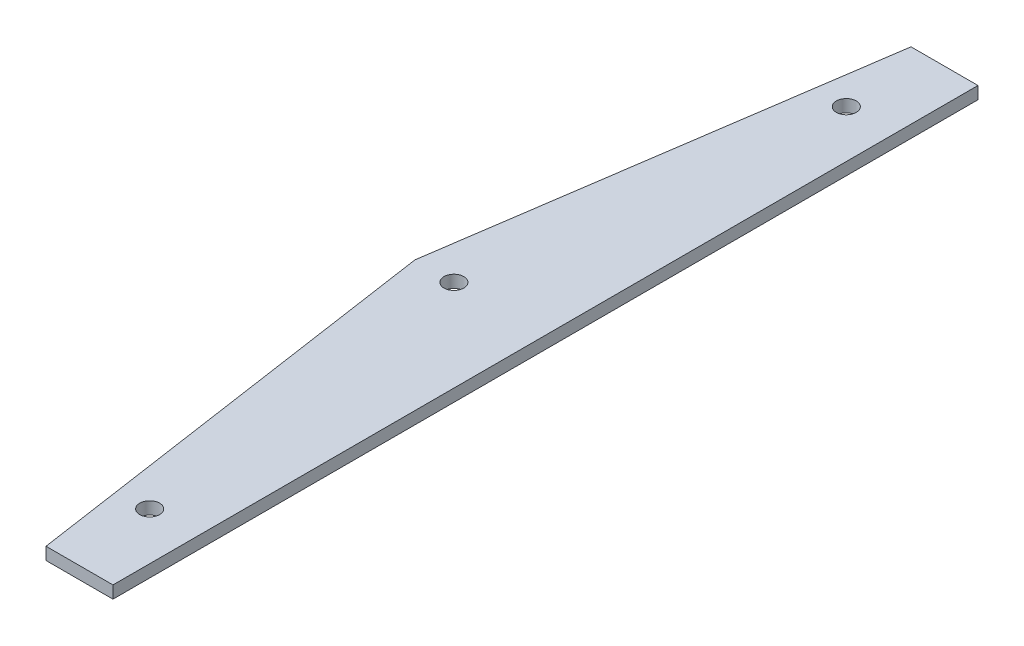
ISO-10303-21;
HEADER;
FILE_DESCRIPTION(('STEP AP214'),'2;1');
FILE_NAME('part.step','',(''),(''),'','','');
FILE_SCHEMA(('AUTOMOTIVE_DESIGN { 1 0 10303 214 1 1 1 1 }'));
ENDSEC;
DATA;
#1=APPLICATION_CONTEXT('core data for automotive mechanical design processes');
#2=APPLICATION_PROTOCOL_DEFINITION('international standard','automotive_design',2000,#1);
#3=PRODUCT_CONTEXT('',#1,'mechanical');
#4=PRODUCT('Part','Part','',(#3));
#5=PRODUCT_RELATED_PRODUCT_CATEGORY('part','',(#4));
#6=PRODUCT_DEFINITION_FORMATION('','',#4);
#7=PRODUCT_DEFINITION_CONTEXT('part definition',#1,'design');
#8=PRODUCT_DEFINITION('design','',#6,#7);
#9=PRODUCT_DEFINITION_SHAPE('','',#8);
#10=(LENGTH_UNIT() NAMED_UNIT(*) SI_UNIT(.MILLI.,.METRE.));
#11=(NAMED_UNIT(*) PLANE_ANGLE_UNIT() SI_UNIT($,.RADIAN.));
#12=(NAMED_UNIT(*) SI_UNIT($,.STERADIAN.) SOLID_ANGLE_UNIT());
#13=UNCERTAINTY_MEASURE_WITH_UNIT(LENGTH_MEASURE(1.E-05),#10,'distance_accuracy_value','');
#14=(GEOMETRIC_REPRESENTATION_CONTEXT(3) GLOBAL_UNCERTAINTY_ASSIGNED_CONTEXT((#13)) GLOBAL_UNIT_ASSIGNED_CONTEXT((#10,
#11,#12)) REPRESENTATION_CONTEXT('',''));
#15=CARTESIAN_POINT('',(0.,0.,0.));
#16=DIRECTION('',(0.,0.,1.));
#17=DIRECTION('',(1.,0.,0.));
#18=AXIS2_PLACEMENT_3D('',#15,#16,#17);
#19=CARTESIAN_POINT('',(-141.516330500068,4.48446008393906,-104.251042846632));
#20=DIRECTION('',(-0.989377136012177,0.,-0.145371533445661));
#21=DIRECTION('',(-0.145371533445661,0.,0.989377136012177));
#22=AXIS2_PLACEMENT_3D('',#19,#20,#21);
#23=PLANE('',#22);
#24=DIRECTION('',(-0.145371533445661,0.,0.989377136012177));
#25=VECTOR('',#24,1.);
#26=CARTESIAN_POINT('',(-141.516330500068,7.65946008393906,-104.251042846632));
#27=LINE('',#26,#25);
#28=CARTESIAN_POINT('',(-141.516330500068,7.65946008393906,-104.251042846632));
#29=VERTEX_POINT('',#28);
#30=CARTESIAN_POINT('',(-157.829549879797,7.65946008393906,6.77431326332184));
#31=VERTEX_POINT('',#30);
#32=EDGE_CURVE('E110',#29,#31,#27,.T.);
#33=ORIENTED_EDGE('',*,*,#32,.F.);
#34=DIRECTION('',(0.,1.,0.));
#35=VECTOR('',#34,1.);
#36=CARTESIAN_POINT('',(-141.516330500068,4.48446008393906,-104.251042846632));
#37=LINE('',#36,#35);
#38=CARTESIAN_POINT('',(-141.516330500068,4.48446008393906,-104.251042846632));
#39=VERTEX_POINT('',#38);
#40=EDGE_CURVE('E11',#39,#29,#37,.T.);
#41=ORIENTED_EDGE('',*,*,#40,.F.);
#42=DIRECTION('',(-0.145371533445661,0.,0.989377136012177));
#43=VECTOR('',#42,1.);
#44=CARTESIAN_POINT('',(-141.516330500068,4.48446008393906,-104.251042846632));
#45=LINE('',#44,#43);
#46=CARTESIAN_POINT('',(-157.829549879797,4.48446008393906,6.77431326332184));
#47=VERTEX_POINT('',#46);
#48=EDGE_CURVE('E105',#39,#47,#45,.T.);
#49=ORIENTED_EDGE('',*,*,#48,.T.);
#50=DIRECTION('',(0.,1.,0.));
#51=VECTOR('',#50,1.);
#52=CARTESIAN_POINT('',(-157.829549879797,4.48446008393906,6.77431326332184));
#53=LINE('',#52,#51);
#54=EDGE_CURVE('E36',#47,#31,#53,.T.);
#55=ORIENTED_EDGE('',*,*,#54,.T.);
#56=EDGE_LOOP('',(#33,#41,#49,#55));
#57=FACE_BOUND('',#56,.T.);
#58=ADVANCED_FACE('F33',(#57),#23,.T.);
#59=CARTESIAN_POINT('',(-141.516330500068,4.48446008393906,-104.251042846632));
#60=DIRECTION('',(0.,0.,-1.));
#61=DIRECTION('',(-1.,0.,0.));
#62=AXIS2_PLACEMENT_3D('',#59,#60,#61);
#63=PLANE('',#62);
#64=DIRECTION('',(-1.,0.,0.));
#65=VECTOR('',#64,1.);
#66=CARTESIAN_POINT('',(-141.516330500068,7.65946008393906,-104.251042846632));
#67=LINE('',#66,#65);
#68=CARTESIAN_POINT('',(-124.323681088503,7.65946008393906,-104.251042846632));
#69=VERTEX_POINT('',#68);
#70=EDGE_CURVE('E120',#69,#29,#67,.T.);
#71=ORIENTED_EDGE('',*,*,#70,.F.);
#72=DIRECTION('',(0.,1.,0.));
#73=VECTOR('',#72,1.);
#74=CARTESIAN_POINT('',(-124.323681088503,4.48446008393906,-104.251042846632));
#75=LINE('',#74,#73);
#76=CARTESIAN_POINT('',(-124.323681088503,4.48446008393906,-104.251042846632));
#77=VERTEX_POINT('',#76);
#78=EDGE_CURVE('E42',#77,#69,#75,.T.);
#79=ORIENTED_EDGE('',*,*,#78,.F.);
#80=DIRECTION('',(-1.,0.,0.));
#81=VECTOR('',#80,1.);
#82=CARTESIAN_POINT('',(-141.516330500068,4.48446008393906,-104.251042846632));
#83=LINE('',#82,#81);
#84=EDGE_CURVE('E100',#77,#39,#83,.T.);
#85=ORIENTED_EDGE('',*,*,#84,.T.);
#86=ORIENTED_EDGE('',*,*,#40,.T.);
#87=EDGE_LOOP('',(#71,#79,#85,#86));
#88=FACE_BOUND('',#87,.T.);
#89=ADVANCED_FACE('F126',(#88),#63,.T.);
#90=CARTESIAN_POINT('',(-124.323681088503,4.48446008393906,-104.251042846632));
#91=DIRECTION('',(1.,0.,0.));
#92=DIRECTION('',(0.,0.,-1.));
#93=AXIS2_PLACEMENT_3D('',#90,#91,#92);
#94=PLANE('',#93);
#95=DIRECTION('',(0.,0.,-1.));
#96=VECTOR('',#95,1.);
#97=CARTESIAN_POINT('',(-124.323681088503,7.65946008393906,-104.251042846632));
#98=LINE('',#97,#96);
#99=CARTESIAN_POINT('',(-124.323681088503,7.65946008393906,117.799669373275));
#100=VERTEX_POINT('',#99);
#101=EDGE_CURVE('E89',#100,#69,#98,.T.);
#102=ORIENTED_EDGE('',*,*,#101,.F.);
#103=DIRECTION('',(0.,1.,0.));
#104=VECTOR('',#103,1.);
#105=CARTESIAN_POINT('',(-124.323681088503,4.48446008393906,117.799669373275));
#106=LINE('',#105,#104);
#107=CARTESIAN_POINT('',(-124.323681088503,4.48446008393906,117.799669373275));
#108=VERTEX_POINT('',#107);
#109=EDGE_CURVE('E84',#108,#100,#106,.T.);
#110=ORIENTED_EDGE('',*,*,#109,.F.);
#111=DIRECTION('',(0.,0.,-1.));
#112=VECTOR('',#111,1.);
#113=CARTESIAN_POINT('',(-124.323681088503,4.48446008393906,-104.251042846632));
#114=LINE('',#113,#112);
#115=EDGE_CURVE('E87',#108,#77,#114,.T.);
#116=ORIENTED_EDGE('',*,*,#115,.T.);
#117=ORIENTED_EDGE('',*,*,#78,.T.);
#118=EDGE_LOOP('',(#102,#110,#116,#117));
#119=FACE_BOUND('',#118,.T.);
#120=ADVANCED_FACE('F86',(#119),#94,.T.);
#121=CARTESIAN_POINT('',(-141.516330500068,4.48446008393906,117.799669373275));
#122=DIRECTION('',(0.,0.,1.));
#123=DIRECTION('',(1.,0.,0.));
#124=AXIS2_PLACEMENT_3D('',#121,#122,#123);
#125=PLANE('',#124);
#126=DIRECTION('',(1.,0.,0.));
#127=VECTOR('',#126,1.);
#128=CARTESIAN_POINT('',(-141.516330500068,7.65946008393906,117.799669373275));
#129=LINE('',#128,#127);
#130=CARTESIAN_POINT('',(-141.516330500068,7.65946008393906,117.799669373275));
#131=VERTEX_POINT('',#130);
#132=EDGE_CURVE('E117',#131,#100,#129,.T.);
#133=ORIENTED_EDGE('',*,*,#132,.F.);
#134=DIRECTION('',(0.,1.,0.));
#135=VECTOR('',#134,1.);
#136=CARTESIAN_POINT('',(-141.516330500068,4.48446008393906,117.799669373275));
#137=LINE('',#136,#135);
#138=CARTESIAN_POINT('',(-141.516330500068,4.48446008393906,117.799669373275));
#139=VERTEX_POINT('',#138);
#140=EDGE_CURVE('E94',#139,#131,#137,.T.);
#141=ORIENTED_EDGE('',*,*,#140,.F.);
#142=DIRECTION('',(1.,0.,0.));
#143=VECTOR('',#142,1.);
#144=CARTESIAN_POINT('',(-141.516330500068,4.48446008393906,117.799669373275));
#145=LINE('',#144,#143);
#146=EDGE_CURVE('E99',#139,#108,#145,.T.);
#147=ORIENTED_EDGE('',*,*,#146,.T.);
#148=ORIENTED_EDGE('',*,*,#109,.T.);
#149=EDGE_LOOP('',(#133,#141,#147,#148));
#150=FACE_BOUND('',#149,.T.);
#151=ADVANCED_FACE('F102',(#150),#125,.T.);
#152=CARTESIAN_POINT('',(-157.829549879797,4.48446008393906,6.77431326332184));
#153=DIRECTION('',(-0.989377136012177,0.,0.145371533445661));
#154=DIRECTION('',(0.145371533445661,0.,0.989377136012177));
#155=AXIS2_PLACEMENT_3D('',#152,#153,#154);
#156=PLANE('',#155);
#157=DIRECTION('',(0.145371533445661,0.,0.989377136012177));
#158=VECTOR('',#157,1.);
#159=CARTESIAN_POINT('',(-157.829549879797,7.65946008393906,6.77431326332184));
#160=LINE('',#159,#158);
#161=EDGE_CURVE('E113',#31,#131,#160,.T.);
#162=ORIENTED_EDGE('',*,*,#161,.F.);
#163=ORIENTED_EDGE('',*,*,#54,.F.);
#164=DIRECTION('',(0.145371533445661,0.,0.989377136012177));
#165=VECTOR('',#164,1.);
#166=CARTESIAN_POINT('',(-157.829549879797,4.48446008393906,6.77431326332184));
#167=LINE('',#166,#165);
#168=EDGE_CURVE('E103',#47,#139,#167,.T.);
#169=ORIENTED_EDGE('',*,*,#168,.T.);
#170=ORIENTED_EDGE('',*,*,#140,.T.);
#171=EDGE_LOOP('',(#162,#163,#169,#170));
#172=FACE_BOUND('',#171,.T.);
#173=ADVANCED_FACE('F123',(#172),#156,.T.);
#174=CARTESIAN_POINT('',(0.,4.48446008393906,0.));
#175=DIRECTION('',(0.,1.,0.));
#176=DIRECTION('',(0.,0.,1.));
#177=AXIS2_PLACEMENT_3D('',#174,#175,#176);
#178=PLANE('',#177);
#179=CARTESIAN_POINT('',(-136.516330500068,4.48446008393906,-82.6365222643934));
#180=DIRECTION('',(0.,1.,0.));
#181=DIRECTION('',(0.,0.,1.));
#182=AXIS2_PLACEMENT_3D('',#179,#180,#181);
#183=CIRCLE('',#182,2.55269999999998);
#184=CARTESIAN_POINT('',(-136.516330500068,4.48446008393906,-80.0838222643934));
#185=VERTEX_POINT('',#184);
#186=EDGE_CURVE('E165',#185,#185,#183,.T.);
#187=ORIENTED_EDGE('',*,*,#186,.T.);
#188=EDGE_LOOP('',(#187));
#189=FACE_BOUND('',#188,.T.);
#190=CARTESIAN_POINT('',(-147.829549879797,4.48446008393906,6.77431326332184));
#191=DIRECTION('',(0.,1.,0.));
#192=DIRECTION('',(0.,0.,1.));
#193=AXIS2_PLACEMENT_3D('',#190,#191,#192);
#194=CIRCLE('',#193,2.55269999999999);
#195=CARTESIAN_POINT('',(-147.829549879797,4.48446008393906,9.32701326332183));
#196=VERTEX_POINT('',#195);
#197=EDGE_CURVE('E173',#196,#196,#194,.T.);
#198=ORIENTED_EDGE('',*,*,#197,.T.);
#199=EDGE_LOOP('',(#198));
#200=FACE_BOUND('',#199,.T.);
#201=CARTESIAN_POINT('',(-136.516330500068,4.48446008393906,96.1851487910371));
#202=DIRECTION('',(0.,1.,0.));
#203=DIRECTION('',(0.,0.,1.));
#204=AXIS2_PLACEMENT_3D('',#201,#202,#203);
#205=CIRCLE('',#204,2.55269999999998);
#206=CARTESIAN_POINT('',(-136.516330500068,4.48446008393906,98.7378487910371));
#207=VERTEX_POINT('',#206);
#208=EDGE_CURVE('E114',#207,#207,#205,.T.);
#209=ORIENTED_EDGE('',*,*,#208,.T.);
#210=EDGE_LOOP('',(#209));
#211=FACE_BOUND('',#210,.T.);
#212=ORIENTED_EDGE('',*,*,#48,.F.);
#213=ORIENTED_EDGE('',*,*,#84,.F.);
#214=ORIENTED_EDGE('',*,*,#115,.F.);
#215=ORIENTED_EDGE('',*,*,#146,.F.);
#216=ORIENTED_EDGE('',*,*,#168,.F.);
#217=EDGE_LOOP('',(#212,#213,#214,#215,#216));
#218=FACE_BOUND('',#217,.T.);
#219=ADVANCED_FACE('F98',(#189,#200,#211,#218),#178,.F.);
#220=CARTESIAN_POINT('',(0.,7.65946008393906,0.));
#221=DIRECTION('',(0.,1.,0.));
#222=DIRECTION('',(0.,0.,1.));
#223=AXIS2_PLACEMENT_3D('',#220,#221,#222);
#224=PLANE('',#223);
#225=CARTESIAN_POINT('',(-136.516330500068,7.65946008393906,-82.6365222643934));
#226=DIRECTION('',(0.,1.,0.));
#227=DIRECTION('',(0.,0.,1.));
#228=AXIS2_PLACEMENT_3D('',#225,#226,#227);
#229=CIRCLE('',#228,2.55269999999998);
#230=CARTESIAN_POINT('',(-136.516330500068,7.65946008393906,-80.0838222643934));
#231=VERTEX_POINT('',#230);
#232=EDGE_CURVE('E168',#231,#231,#229,.T.);
#233=ORIENTED_EDGE('',*,*,#232,.F.);
#234=EDGE_LOOP('',(#233));
#235=FACE_BOUND('',#234,.T.);
#236=CARTESIAN_POINT('',(-147.829549879797,7.65946008393906,6.77431326332184));
#237=DIRECTION('',(0.,1.,0.));
#238=DIRECTION('',(0.,0.,1.));
#239=AXIS2_PLACEMENT_3D('',#236,#237,#238);
#240=CIRCLE('',#239,2.55269999999999);
#241=CARTESIAN_POINT('',(-147.829549879797,7.65946008393906,9.32701326332183));
#242=VERTEX_POINT('',#241);
#243=EDGE_CURVE('E170',#242,#242,#240,.T.);
#244=ORIENTED_EDGE('',*,*,#243,.F.);
#245=EDGE_LOOP('',(#244));
#246=FACE_BOUND('',#245,.T.);
#247=CARTESIAN_POINT('',(-136.516330500068,7.65946008393906,96.1851487910371));
#248=DIRECTION('',(0.,1.,0.));
#249=DIRECTION('',(0.,0.,1.));
#250=AXIS2_PLACEMENT_3D('',#247,#248,#249);
#251=CIRCLE('',#250,2.55269999999998);
#252=CARTESIAN_POINT('',(-136.516330500068,7.65946008393906,98.7378487910371));
#253=VERTEX_POINT('',#252);
#254=EDGE_CURVE('E176',#253,#253,#251,.T.);
#255=ORIENTED_EDGE('',*,*,#254,.F.);
#256=EDGE_LOOP('',(#255));
#257=FACE_BOUND('',#256,.T.);
#258=ORIENTED_EDGE('',*,*,#32,.T.);
#259=ORIENTED_EDGE('',*,*,#161,.T.);
#260=ORIENTED_EDGE('',*,*,#132,.T.);
#261=ORIENTED_EDGE('',*,*,#101,.T.);
#262=ORIENTED_EDGE('',*,*,#70,.T.);
#263=EDGE_LOOP('',(#258,#259,#260,#261,#262));
#264=FACE_BOUND('',#263,.T.);
#265=ADVANCED_FACE('F125',(#235,#246,#257,#264),#224,.T.);
#266=CARTESIAN_POINT('',(-136.516330500068,4.48446008393906,96.1851487910371));
#267=DIRECTION('',(0.,1.,0.));
#268=DIRECTION('',(0.,0.,1.));
#269=AXIS2_PLACEMENT_3D('',#266,#267,#268);
#270=CYLINDRICAL_SURFACE('',#269,2.55269999999998);
#271=ORIENTED_EDGE('',*,*,#208,.F.);
#272=EDGE_LOOP('',(#271));
#273=FACE_BOUND('',#272,.T.);
#274=ORIENTED_EDGE('',*,*,#254,.T.);
#275=EDGE_LOOP('',(#274));
#276=FACE_BOUND('',#275,.T.);
#277=ADVANCED_FACE('F146',(#273,#276),#270,.F.);
#278=CARTESIAN_POINT('',(-147.829549879797,4.48446008393906,6.77431326332184));
#279=DIRECTION('',(0.,1.,0.));
#280=DIRECTION('',(0.,0.,1.));
#281=AXIS2_PLACEMENT_3D('',#278,#279,#280);
#282=CYLINDRICAL_SURFACE('',#281,2.55269999999999);
#283=ORIENTED_EDGE('',*,*,#197,.F.);
#284=EDGE_LOOP('',(#283));
#285=FACE_BOUND('',#284,.T.);
#286=ORIENTED_EDGE('',*,*,#243,.T.);
#287=EDGE_LOOP('',(#286));
#288=FACE_BOUND('',#287,.T.);
#289=ADVANCED_FACE('F153',(#285,#288),#282,.F.);
#290=CARTESIAN_POINT('',(-136.516330500068,4.48446008393906,-82.6365222643934));
#291=DIRECTION('',(0.,1.,0.));
#292=DIRECTION('',(0.,0.,1.));
#293=AXIS2_PLACEMENT_3D('',#290,#291,#292);
#294=CYLINDRICAL_SURFACE('',#293,2.55269999999998);
#295=ORIENTED_EDGE('',*,*,#186,.F.);
#296=EDGE_LOOP('',(#295));
#297=FACE_BOUND('',#296,.T.);
#298=ORIENTED_EDGE('',*,*,#232,.T.);
#299=EDGE_LOOP('',(#298));
#300=FACE_BOUND('',#299,.T.);
#301=ADVANCED_FACE('F157',(#297,#300),#294,.F.);
#302=CLOSED_SHELL('',(#58,#89,#120,#151,#173,#219,#265,#277,#289,#301));
#303=MANIFOLD_SOLID_BREP('B2',#302);
#304=ADVANCED_BREP_SHAPE_REPRESENTATION('',(#18,#303),#14);
#305=SHAPE_DEFINITION_REPRESENTATION(#9,#304);
ENDSEC;
END-ISO-10303-21;
